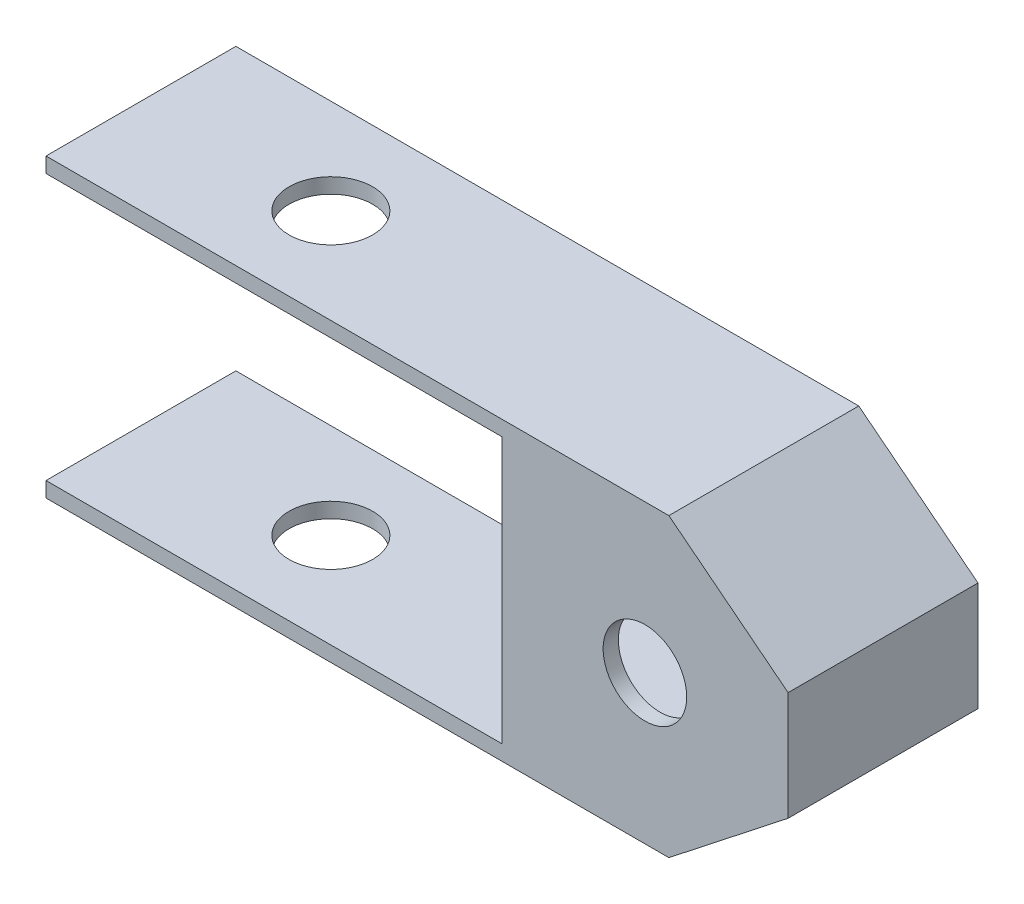
ISO-10303-21;
HEADER;
FILE_DESCRIPTION(('STEP AP214'),'2;1');
FILE_NAME('part.step','',(''),(''),'','','');
FILE_SCHEMA(('AUTOMOTIVE_DESIGN { 1 0 10303 214 1 1 1 1 }'));
ENDSEC;
DATA;
#1=APPLICATION_CONTEXT('core data for automotive mechanical design processes');
#2=APPLICATION_PROTOCOL_DEFINITION('international standard','automotive_design',2000,#1);
#3=PRODUCT_CONTEXT('',#1,'mechanical');
#4=PRODUCT('Part','Part','',(#3));
#5=PRODUCT_RELATED_PRODUCT_CATEGORY('part','',(#4));
#6=PRODUCT_DEFINITION_FORMATION('','',#4);
#7=PRODUCT_DEFINITION_CONTEXT('part definition',#1,'design');
#8=PRODUCT_DEFINITION('design','',#6,#7);
#9=PRODUCT_DEFINITION_SHAPE('','',#8);
#10=(LENGTH_UNIT() NAMED_UNIT(*) SI_UNIT(.MILLI.,.METRE.));
#11=(NAMED_UNIT(*) PLANE_ANGLE_UNIT() SI_UNIT($,.RADIAN.));
#12=(NAMED_UNIT(*) SI_UNIT($,.STERADIAN.) SOLID_ANGLE_UNIT());
#13=UNCERTAINTY_MEASURE_WITH_UNIT(LENGTH_MEASURE(1.E-05),#10,'distance_accuracy_value','');
#14=(GEOMETRIC_REPRESENTATION_CONTEXT(3) GLOBAL_UNCERTAINTY_ASSIGNED_CONTEXT((#13)) GLOBAL_UNIT_ASSIGNED_CONTEXT((#10,
#11,#12)) REPRESENTATION_CONTEXT('',''));
#15=CARTESIAN_POINT('',(0.,0.,0.));
#16=DIRECTION('',(0.,0.,1.));
#17=DIRECTION('',(1.,0.,0.));
#18=AXIS2_PLACEMENT_3D('',#15,#16,#17);
#19=CARTESIAN_POINT('',(0.,0.,0.));
#20=DIRECTION('',(-1.,0.,0.));
#21=DIRECTION('',(0.,0.,1.));
#22=AXIS2_PLACEMENT_3D('',#19,#20,#21);
#23=PLANE('',#22);
#24=DIRECTION('',(0.,0.,1.));
#25=VECTOR('',#24,1.);
#26=CARTESIAN_POINT('',(0.,0.,0.));
#27=LINE('',#26,#25);
#28=CARTESIAN_POINT('',(0.,0.,23.));
#29=VERTEX_POINT('',#28);
#30=CARTESIAN_POINT('',(0.,0.,25.));
#31=VERTEX_POINT('',#30);
#32=EDGE_CURVE('E269',#29,#31,#27,.T.);
#33=ORIENTED_EDGE('',*,*,#32,.F.);
#34=DIRECTION('',(0.,-1.,0.));
#35=VECTOR('',#34,1.);
#36=CARTESIAN_POINT('',(0.,0.,23.));
#37=LINE('',#36,#35);
#38=CARTESIAN_POINT('',(0.,-35.,23.));
#39=VERTEX_POINT('',#38);
#40=EDGE_CURVE('E218',#29,#39,#37,.T.);
#41=ORIENTED_EDGE('',*,*,#40,.T.);
#42=DIRECTION('',(0.,0.,1.));
#43=VECTOR('',#42,1.);
#44=CARTESIAN_POINT('',(0.,-35.,0.));
#45=LINE('',#44,#43);
#46=CARTESIAN_POINT('',(0.,-35.,25.));
#47=VERTEX_POINT('',#46);
#48=EDGE_CURVE('E248',#39,#47,#45,.T.);
#49=ORIENTED_EDGE('',*,*,#48,.T.);
#50=DIRECTION('',(0.,-1.,0.));
#51=VECTOR('',#50,1.);
#52=CARTESIAN_POINT('',(0.,0.,25.));
#53=LINE('',#52,#51);
#54=EDGE_CURVE('E252',#31,#47,#53,.T.);
#55=ORIENTED_EDGE('',*,*,#54,.F.);
#56=EDGE_LOOP('',(#33,#41,#49,#55));
#57=FACE_BOUND('',#56,.T.);
#58=ADVANCED_FACE('F41',(#57),#23,.T.);
#59=CARTESIAN_POINT('',(-60.,0.,25.));
#60=DIRECTION('',(1.,0.,0.));
#61=DIRECTION('',(0.,0.,-1.));
#62=AXIS2_PLACEMENT_3D('',#59,#60,#61);
#63=PLANE('',#62);
#64=DIRECTION('',(0.,0.,1.));
#65=VECTOR('',#64,1.);
#66=CARTESIAN_POINT('',(-60.,-35.,0.));
#67=LINE('',#66,#65);
#68=CARTESIAN_POINT('',(-60.,-35.,0.));
#69=VERTEX_POINT('',#68);
#70=CARTESIAN_POINT('',(-60.,-35.,25.));
#71=VERTEX_POINT('',#70);
#72=EDGE_CURVE('E259',#69,#71,#67,.T.);
#73=ORIENTED_EDGE('',*,*,#72,.F.);
#74=DIRECTION('',(0.,-1.,0.));
#75=VECTOR('',#74,1.);
#76=CARTESIAN_POINT('',(-60.,0.,0.));
#77=LINE('',#76,#75);
#78=CARTESIAN_POINT('',(-60.,-37.,0.));
#79=VERTEX_POINT('',#78);
#80=EDGE_CURVE('E262',#69,#79,#77,.T.);
#81=ORIENTED_EDGE('',*,*,#80,.T.);
#82=DIRECTION('',(0.,0.,-1.));
#83=VECTOR('',#82,1.);
#84=CARTESIAN_POINT('',(-60.,-37.,25.));
#85=LINE('',#84,#83);
#86=CARTESIAN_POINT('',(-60.,-37.,25.));
#87=VERTEX_POINT('',#86);
#88=EDGE_CURVE('E11',#87,#79,#85,.T.);
#89=ORIENTED_EDGE('',*,*,#88,.F.);
#90=DIRECTION('',(0.,-1.,0.));
#91=VECTOR('',#90,1.);
#92=CARTESIAN_POINT('',(-60.,0.,25.));
#93=LINE('',#92,#91);
#94=EDGE_CURVE('E279',#71,#87,#93,.T.);
#95=ORIENTED_EDGE('',*,*,#94,.F.);
#96=EDGE_LOOP('',(#73,#81,#89,#95));
#97=FACE_BOUND('',#96,.T.);
#98=ADVANCED_FACE('F43',(#97),#63,.F.);
#99=DIRECTION('',(0.,0.,1.));
#100=VECTOR('',#99,1.);
#101=CARTESIAN_POINT('',(-60.,0.,0.));
#102=LINE('',#101,#100);
#103=CARTESIAN_POINT('',(-60.,0.,0.));
#104=VERTEX_POINT('',#103);
#105=CARTESIAN_POINT('',(-60.,0.,25.));
#106=VERTEX_POINT('',#105);
#107=EDGE_CURVE('E263',#104,#106,#102,.T.);
#108=ORIENTED_EDGE('',*,*,#107,.T.);
#109=CARTESIAN_POINT('',(-60.,1.99999999999999,25.));
#110=VERTEX_POINT('',#109);
#111=EDGE_CURVE('E274',#110,#106,#93,.T.);
#112=ORIENTED_EDGE('',*,*,#111,.F.);
#113=DIRECTION('',(0.,0.,-1.));
#114=VECTOR('',#113,1.);
#115=CARTESIAN_POINT('',(-60.,1.99999999999999,25.));
#116=LINE('',#115,#114);
#117=CARTESIAN_POINT('',(-60.,1.99999999999999,0.));
#118=VERTEX_POINT('',#117);
#119=EDGE_CURVE('E297',#110,#118,#116,.T.);
#120=ORIENTED_EDGE('',*,*,#119,.T.);
#121=EDGE_CURVE('E298',#118,#104,#77,.T.);
#122=ORIENTED_EDGE('',*,*,#121,.T.);
#123=EDGE_LOOP('',(#108,#112,#120,#122));
#124=FACE_BOUND('',#123,.T.);
#125=ADVANCED_FACE('F352',(#124),#63,.F.);
#126=CARTESIAN_POINT('',(0.,0.,25.));
#127=DIRECTION('',(0.,0.,1.));
#128=DIRECTION('',(1.,0.,0.));
#129=AXIS2_PLACEMENT_3D('',#126,#127,#128);
#130=PLANE('',#129);
#131=CARTESIAN_POINT('',(18.8484526302729,-17.5,25.));
#132=DIRECTION('',(0.,0.,1.));
#133=DIRECTION('',(1.,0.,0.));
#134=AXIS2_PLACEMENT_3D('',#131,#132,#133);
#135=CIRCLE('',#134,5.5);
#136=CARTESIAN_POINT('',(24.3484526302729,-17.5,25.));
#137=VERTEX_POINT('',#136);
#138=EDGE_CURVE('E448',#137,#137,#135,.T.);
#139=ORIENTED_EDGE('',*,*,#138,.F.);
#140=EDGE_LOOP('',(#139));
#141=FACE_BOUND('',#140,.T.);
#142=ORIENTED_EDGE('',*,*,#54,.T.);
#143=DIRECTION('',(-1.,0.,0.));
#144=VECTOR('',#143,1.);
#145=CARTESIAN_POINT('',(0.,-35.,25.));
#146=LINE('',#145,#144);
#147=EDGE_CURVE('E237',#47,#71,#146,.T.);
#148=ORIENTED_EDGE('',*,*,#147,.T.);
#149=ORIENTED_EDGE('',*,*,#94,.T.);
#150=DIRECTION('',(-1.,0.,0.));
#151=VECTOR('',#150,1.);
#152=CARTESIAN_POINT('',(0.,-37.,25.));
#153=LINE('',#152,#151);
#154=CARTESIAN_POINT('',(22.,-37.,25.));
#155=VERTEX_POINT('',#154);
#156=EDGE_CURVE('E278',#155,#87,#153,.T.);
#157=ORIENTED_EDGE('',*,*,#156,.F.);
#158=DIRECTION('',(0.78628435317527,0.617864803943182,0.));
#159=VECTOR('',#158,1.);
#160=CARTESIAN_POINT('',(26.3738969765129,-33.5629775195864,25.));
#161=LINE('',#160,#159);
#162=CARTESIAN_POINT('',(37.6969052605458,-24.6653207555818,25.));
#163=VERTEX_POINT('',#162);
#164=EDGE_CURVE('E283',#155,#163,#161,.T.);
#165=ORIENTED_EDGE('',*,*,#164,.T.);
#166=DIRECTION('',(0.,1.,0.));
#167=VECTOR('',#166,1.);
#168=CARTESIAN_POINT('',(37.6969052605458,0.,25.));
#169=LINE('',#168,#167);
#170=CARTESIAN_POINT('',(37.6969052605458,-10.3346792444182,25.));
#171=VERTEX_POINT('',#170);
#172=EDGE_CURVE('E286',#163,#171,#169,.T.);
#173=ORIENTED_EDGE('',*,*,#172,.T.);
#174=DIRECTION('',(0.78628435317527,-0.617864803943182,0.));
#175=VECTOR('',#174,1.);
#176=CARTESIAN_POINT('',(9.37028700637488,11.9244695778976,25.));
#177=LINE('',#176,#175);
#178=CARTESIAN_POINT('',(22.,2.,25.));
#179=VERTEX_POINT('',#178);
#180=EDGE_CURVE('E289',#179,#171,#177,.T.);
#181=ORIENTED_EDGE('',*,*,#180,.F.);
#182=DIRECTION('',(1.,0.,0.));
#183=VECTOR('',#182,1.);
#184=CARTESIAN_POINT('',(0.,2.,25.));
#185=LINE('',#184,#183);
#186=EDGE_CURVE('E293',#110,#179,#185,.T.);
#187=ORIENTED_EDGE('',*,*,#186,.F.);
#188=ORIENTED_EDGE('',*,*,#111,.T.);
#189=DIRECTION('',(1.,0.,0.));
#190=VECTOR('',#189,1.);
#191=CARTESIAN_POINT('',(0.,0.,25.));
#192=LINE('',#191,#190);
#193=EDGE_CURVE('E242',#106,#31,#192,.T.);
#194=ORIENTED_EDGE('',*,*,#193,.T.);
#195=EDGE_LOOP('',(#142,#148,#149,#157,#165,#173,#181,#187,#188,#194));
#196=FACE_BOUND('',#195,.T.);
#197=ADVANCED_FACE('F355',(#141,#196),#130,.T.);
#198=CARTESIAN_POINT('',(0.,0.,0.));
#199=DIRECTION('',(0.,0.,1.));
#200=DIRECTION('',(1.,0.,0.));
#201=AXIS2_PLACEMENT_3D('',#198,#199,#200);
#202=PLANE('',#201);
#203=CARTESIAN_POINT('',(18.8484526302729,-17.5,0.));
#204=DIRECTION('',(0.,0.,1.));
#205=DIRECTION('',(1.,0.,0.));
#206=AXIS2_PLACEMENT_3D('',#203,#204,#205);
#207=CIRCLE('',#206,5.5);
#208=CARTESIAN_POINT('',(24.3484526302729,-17.5,0.));
#209=VERTEX_POINT('',#208);
#210=EDGE_CURVE('E222',#209,#209,#207,.T.);
#211=ORIENTED_EDGE('',*,*,#210,.T.);
#212=EDGE_LOOP('',(#211));
#213=FACE_BOUND('',#212,.T.);
#214=DIRECTION('',(-1.,0.,0.));
#215=VECTOR('',#214,1.);
#216=CARTESIAN_POINT('',(0.,-35.,0.));
#217=LINE('',#216,#215);
#218=CARTESIAN_POINT('',(0.,-35.,0.));
#219=VERTEX_POINT('',#218);
#220=EDGE_CURVE('E238',#219,#69,#217,.T.);
#221=ORIENTED_EDGE('',*,*,#220,.F.);
#222=DIRECTION('',(0.,-1.,0.));
#223=VECTOR('',#222,1.);
#224=CARTESIAN_POINT('',(0.,0.,0.));
#225=LINE('',#224,#223);
#226=CARTESIAN_POINT('',(0.,0.,0.));
#227=VERTEX_POINT('',#226);
#228=EDGE_CURVE('E241',#227,#219,#225,.T.);
#229=ORIENTED_EDGE('',*,*,#228,.F.);
#230=DIRECTION('',(1.,0.,0.));
#231=VECTOR('',#230,1.);
#232=CARTESIAN_POINT('',(0.,0.,0.));
#233=LINE('',#232,#231);
#234=EDGE_CURVE('E245',#104,#227,#233,.T.);
#235=ORIENTED_EDGE('',*,*,#234,.F.);
#236=ORIENTED_EDGE('',*,*,#121,.F.);
#237=DIRECTION('',(1.,0.,0.));
#238=VECTOR('',#237,1.);
#239=CARTESIAN_POINT('',(0.,2.,0.));
#240=LINE('',#239,#238);
#241=CARTESIAN_POINT('',(22.,2.,0.));
#242=VERTEX_POINT('',#241);
#243=EDGE_CURVE('E317',#118,#242,#240,.T.);
#244=ORIENTED_EDGE('',*,*,#243,.T.);
#245=DIRECTION('',(0.78628435317527,-0.617864803943182,0.));
#246=VECTOR('',#245,1.);
#247=CARTESIAN_POINT('',(9.37028700637488,11.9244695778976,0.));
#248=LINE('',#247,#246);
#249=CARTESIAN_POINT('',(37.6969052605458,-10.3346792444182,0.));
#250=VERTEX_POINT('',#249);
#251=EDGE_CURVE('E313',#242,#250,#248,.T.);
#252=ORIENTED_EDGE('',*,*,#251,.T.);
#253=DIRECTION('',(0.,1.,0.));
#254=VECTOR('',#253,1.);
#255=CARTESIAN_POINT('',(37.6969052605458,0.,0.));
#256=LINE('',#255,#254);
#257=CARTESIAN_POINT('',(37.6969052605458,-24.6653207555818,0.));
#258=VERTEX_POINT('',#257);
#259=EDGE_CURVE('E309',#258,#250,#256,.T.);
#260=ORIENTED_EDGE('',*,*,#259,.F.);
#261=DIRECTION('',(0.78628435317527,0.617864803943182,0.));
#262=VECTOR('',#261,1.);
#263=CARTESIAN_POINT('',(26.3738969765129,-33.5629775195864,0.));
#264=LINE('',#263,#262);
#265=CARTESIAN_POINT('',(22.,-37.,0.));
#266=VERTEX_POINT('',#265);
#267=EDGE_CURVE('E306',#266,#258,#264,.T.);
#268=ORIENTED_EDGE('',*,*,#267,.F.);
#269=DIRECTION('',(-1.,0.,0.));
#270=VECTOR('',#269,1.);
#271=CARTESIAN_POINT('',(0.,-37.,0.));
#272=LINE('',#271,#270);
#273=EDGE_CURVE('E302',#266,#79,#272,.T.);
#274=ORIENTED_EDGE('',*,*,#273,.T.);
#275=ORIENTED_EDGE('',*,*,#80,.F.);
#276=EDGE_LOOP('',(#221,#229,#235,#236,#244,#252,#260,#268,#274,#275));
#277=FACE_BOUND('',#276,.T.);
#278=ADVANCED_FACE('F363',(#213,#277),#202,.F.);
#279=CARTESIAN_POINT('',(0.,-37.,25.));
#280=DIRECTION('',(0.,-1.,0.));
#281=DIRECTION('',(1.,0.,0.));
#282=AXIS2_PLACEMENT_3D('',#279,#280,#281);
#283=PLANE('',#282);
#284=CARTESIAN_POINT('',(-35.,-37.,12.5));
#285=DIRECTION('',(0.,-1.,0.));
#286=DIRECTION('',(1.,0.,0.));
#287=AXIS2_PLACEMENT_3D('',#284,#285,#286);
#288=CIRCLE('',#287,5.5);
#289=CARTESIAN_POINT('',(-29.5,-37.,12.5));
#290=VERTEX_POINT('',#289);
#291=EDGE_CURVE('E233',#290,#290,#288,.T.);
#292=ORIENTED_EDGE('',*,*,#291,.F.);
#293=EDGE_LOOP('',(#292));
#294=FACE_BOUND('',#293,.T.);
#295=ORIENTED_EDGE('',*,*,#273,.F.);
#296=DIRECTION('',(0.,0.,-1.));
#297=VECTOR('',#296,1.);
#298=CARTESIAN_POINT('',(22.,-37.,25.));
#299=LINE('',#298,#297);
#300=EDGE_CURVE('E51',#155,#266,#299,.T.);
#301=ORIENTED_EDGE('',*,*,#300,.F.);
#302=ORIENTED_EDGE('',*,*,#156,.T.);
#303=ORIENTED_EDGE('',*,*,#88,.T.);
#304=EDGE_LOOP('',(#295,#301,#302,#303));
#305=FACE_BOUND('',#304,.T.);
#306=ADVANCED_FACE('F400',(#294,#305),#283,.T.);
#307=CARTESIAN_POINT('',(26.3738969765129,-33.5629775195864,25.));
#308=DIRECTION('',(-0.617864803943182,0.78628435317527,0.));
#309=DIRECTION('',(-0.78628435317527,-0.617864803943182,0.));
#310=AXIS2_PLACEMENT_3D('',#307,#308,#309);
#311=PLANE('',#310);
#312=ORIENTED_EDGE('',*,*,#267,.T.);
#313=DIRECTION('',(0.,0.,-1.));
#314=VECTOR('',#313,1.);
#315=CARTESIAN_POINT('',(37.6969052605458,-24.6653207555818,25.));
#316=LINE('',#315,#314);
#317=EDGE_CURVE('E329',#163,#258,#316,.T.);
#318=ORIENTED_EDGE('',*,*,#317,.F.);
#319=ORIENTED_EDGE('',*,*,#164,.F.);
#320=ORIENTED_EDGE('',*,*,#300,.T.);
#321=EDGE_LOOP('',(#312,#318,#319,#320));
#322=FACE_BOUND('',#321,.T.);
#323=ADVANCED_FACE('F405',(#322),#311,.F.);
#324=CARTESIAN_POINT('',(37.6969052605458,0.,25.));
#325=DIRECTION('',(-1.,0.,0.));
#326=DIRECTION('',(0.,0.,1.));
#327=AXIS2_PLACEMENT_3D('',#324,#325,#326);
#328=PLANE('',#327);
#329=ORIENTED_EDGE('',*,*,#259,.T.);
#330=DIRECTION('',(0.,0.,-1.));
#331=VECTOR('',#330,1.);
#332=CARTESIAN_POINT('',(37.6969052605458,-10.3346792444182,25.));
#333=LINE('',#332,#331);
#334=EDGE_CURVE('E326',#171,#250,#333,.T.);
#335=ORIENTED_EDGE('',*,*,#334,.F.);
#336=ORIENTED_EDGE('',*,*,#172,.F.);
#337=ORIENTED_EDGE('',*,*,#317,.T.);
#338=EDGE_LOOP('',(#329,#335,#336,#337));
#339=FACE_BOUND('',#338,.T.);
#340=ADVANCED_FACE('F409',(#339),#328,.F.);
#341=CARTESIAN_POINT('',(9.37028700637488,11.9244695778976,25.));
#342=DIRECTION('',(0.617864803943182,0.78628435317527,0.));
#343=DIRECTION('',(-0.78628435317527,0.617864803943182,0.));
#344=AXIS2_PLACEMENT_3D('',#341,#342,#343);
#345=PLANE('',#344);
#346=ORIENTED_EDGE('',*,*,#251,.F.);
#347=DIRECTION('',(0.,0.,-1.));
#348=VECTOR('',#347,1.);
#349=CARTESIAN_POINT('',(22.,2.,25.));
#350=LINE('',#349,#348);
#351=EDGE_CURVE('E323',#179,#242,#350,.T.);
#352=ORIENTED_EDGE('',*,*,#351,.F.);
#353=ORIENTED_EDGE('',*,*,#180,.T.);
#354=ORIENTED_EDGE('',*,*,#334,.T.);
#355=EDGE_LOOP('',(#346,#352,#353,#354));
#356=FACE_BOUND('',#355,.T.);
#357=ADVANCED_FACE('F412',(#356),#345,.T.);
#358=CARTESIAN_POINT('',(0.,2.,25.));
#359=DIRECTION('',(0.,1.,0.));
#360=DIRECTION('',(0.,0.,1.));
#361=AXIS2_PLACEMENT_3D('',#358,#359,#360);
#362=PLANE('',#361);
#363=CARTESIAN_POINT('',(-35.,2.,12.5));
#364=DIRECTION('',(0.,1.,0.));
#365=DIRECTION('',(0.,0.,1.));
#366=AXIS2_PLACEMENT_3D('',#363,#364,#365);
#367=CIRCLE('',#366,5.5);
#368=CARTESIAN_POINT('',(-35.,2.,18.));
#369=VERTEX_POINT('',#368);
#370=EDGE_CURVE('E211',#369,#369,#367,.T.);
#371=ORIENTED_EDGE('',*,*,#370,.F.);
#372=EDGE_LOOP('',(#371));
#373=FACE_BOUND('',#372,.T.);
#374=ORIENTED_EDGE('',*,*,#243,.F.);
#375=ORIENTED_EDGE('',*,*,#119,.F.);
#376=ORIENTED_EDGE('',*,*,#186,.T.);
#377=ORIENTED_EDGE('',*,*,#351,.T.);
#378=EDGE_LOOP('',(#374,#375,#376,#377));
#379=FACE_BOUND('',#378,.T.);
#380=ADVANCED_FACE('F359',(#373,#379),#362,.T.);
#381=CARTESIAN_POINT('',(0.,-35.,0.));
#382=DIRECTION('',(0.,1.,0.));
#383=DIRECTION('',(0.,0.,1.));
#384=AXIS2_PLACEMENT_3D('',#381,#382,#383);
#385=PLANE('',#384);
#386=CARTESIAN_POINT('',(-35.,-35.,12.5));
#387=DIRECTION('',(0.,1.,0.));
#388=DIRECTION('',(0.,0.,1.));
#389=AXIS2_PLACEMENT_3D('',#386,#387,#388);
#390=CIRCLE('',#389,5.5);
#391=CARTESIAN_POINT('',(-35.,-35.,18.));
#392=VERTEX_POINT('',#391);
#393=EDGE_CURVE('E229',#392,#392,#390,.T.);
#394=ORIENTED_EDGE('',*,*,#393,.F.);
#395=EDGE_LOOP('',(#394));
#396=FACE_BOUND('',#395,.T.);
#397=ORIENTED_EDGE('',*,*,#147,.F.);
#398=ORIENTED_EDGE('',*,*,#48,.F.);
#399=DIRECTION('',(-1.,0.,0.));
#400=VECTOR('',#399,1.);
#401=CARTESIAN_POINT('',(0.,-35.,23.));
#402=LINE('',#401,#400);
#403=CARTESIAN_POINT('',(21.3082122643633,-35.,23.));
#404=VERTEX_POINT('',#403);
#405=EDGE_CURVE('E170',#404,#39,#402,.T.);
#406=ORIENTED_EDGE('',*,*,#405,.F.);
#407=DIRECTION('',(0.,0.,-1.));
#408=VECTOR('',#407,1.);
#409=CARTESIAN_POINT('',(21.3082122643633,-35.,25.));
#410=LINE('',#409,#408);
#411=CARTESIAN_POINT('',(21.3082122643633,-35.,2.));
#412=VERTEX_POINT('',#411);
#413=EDGE_CURVE('E165',#404,#412,#410,.T.);
#414=ORIENTED_EDGE('',*,*,#413,.T.);
#415=DIRECTION('',(-1.,0.,0.));
#416=VECTOR('',#415,1.);
#417=CARTESIAN_POINT('',(0.,-35.,2.));
#418=LINE('',#417,#416);
#419=CARTESIAN_POINT('',(0.,-35.,2.));
#420=VERTEX_POINT('',#419);
#421=EDGE_CURVE('E205',#412,#420,#418,.T.);
#422=ORIENTED_EDGE('',*,*,#421,.T.);
#423=EDGE_CURVE('E270',#219,#420,#45,.T.);
#424=ORIENTED_EDGE('',*,*,#423,.F.);
#425=ORIENTED_EDGE('',*,*,#220,.T.);
#426=ORIENTED_EDGE('',*,*,#72,.T.);
#427=EDGE_LOOP('',(#397,#398,#406,#414,#422,#424,#425,#426));
#428=FACE_BOUND('',#427,.T.);
#429=ADVANCED_FACE('F344',(#396,#428),#385,.T.);
#430=CARTESIAN_POINT('',(0.,0.,0.));
#431=DIRECTION('',(0.,-1.,0.));
#432=DIRECTION('',(0.,0.,-1.));
#433=AXIS2_PLACEMENT_3D('',#430,#431,#432);
#434=PLANE('',#433);
#435=CARTESIAN_POINT('',(-35.,0.,12.5));
#436=DIRECTION('',(0.,-1.,0.));
#437=DIRECTION('',(0.,0.,-1.));
#438=AXIS2_PLACEMENT_3D('',#435,#436,#437);
#439=CIRCLE('',#438,5.5);
#440=CARTESIAN_POINT('',(-35.,0.,7.));
#441=VERTEX_POINT('',#440);
#442=EDGE_CURVE('E228',#441,#441,#439,.T.);
#443=ORIENTED_EDGE('',*,*,#442,.F.);
#444=EDGE_LOOP('',(#443));
#445=FACE_BOUND('',#444,.T.);
#446=ORIENTED_EDGE('',*,*,#193,.F.);
#447=ORIENTED_EDGE('',*,*,#107,.F.);
#448=ORIENTED_EDGE('',*,*,#234,.T.);
#449=CARTESIAN_POINT('',(0.,0.,2.));
#450=VERTEX_POINT('',#449);
#451=EDGE_CURVE('E67',#227,#450,#27,.T.);
#452=ORIENTED_EDGE('',*,*,#451,.T.);
#453=DIRECTION('',(1.,0.,0.));
#454=VECTOR('',#453,1.);
#455=CARTESIAN_POINT('',(0.,0.,2.));
#456=LINE('',#455,#454);
#457=CARTESIAN_POINT('',(21.3082122643633,0.,2.));
#458=VERTEX_POINT('',#457);
#459=EDGE_CURVE('E193',#450,#458,#456,.T.);
#460=ORIENTED_EDGE('',*,*,#459,.T.);
#461=DIRECTION('',(0.,0.,-1.));
#462=VECTOR('',#461,1.);
#463=CARTESIAN_POINT('',(21.3082122643633,0.,25.));
#464=LINE('',#463,#462);
#465=CARTESIAN_POINT('',(21.3082122643633,0.,23.));
#466=VERTEX_POINT('',#465);
#467=EDGE_CURVE('E192',#466,#458,#464,.T.);
#468=ORIENTED_EDGE('',*,*,#467,.F.);
#469=DIRECTION('',(1.,0.,0.));
#470=VECTOR('',#469,1.);
#471=CARTESIAN_POINT('',(0.,0.,23.));
#472=LINE('',#471,#470);
#473=EDGE_CURVE('E59',#29,#466,#472,.T.);
#474=ORIENTED_EDGE('',*,*,#473,.F.);
#475=ORIENTED_EDGE('',*,*,#32,.T.);
#476=EDGE_LOOP('',(#446,#447,#448,#452,#460,#468,#474,#475));
#477=FACE_BOUND('',#476,.T.);
#478=ADVANCED_FACE('F341',(#445,#477),#434,.T.);
#479=DIRECTION('',(0.,-1.,0.));
#480=VECTOR('',#479,1.);
#481=CARTESIAN_POINT('',(0.,0.,2.));
#482=LINE('',#481,#480);
#483=EDGE_CURVE('E209',#450,#420,#482,.T.);
#484=ORIENTED_EDGE('',*,*,#483,.F.);
#485=ORIENTED_EDGE('',*,*,#451,.F.);
#486=ORIENTED_EDGE('',*,*,#228,.T.);
#487=ORIENTED_EDGE('',*,*,#423,.T.);
#488=EDGE_LOOP('',(#484,#485,#486,#487));
#489=FACE_BOUND('',#488,.T.);
#490=ADVANCED_FACE('F343',(#489),#23,.T.);
#491=CARTESIAN_POINT('',(-35.,-65.,12.5));
#492=DIRECTION('',(0.,1.,0.));
#493=DIRECTION('',(0.,0.,1.));
#494=AXIS2_PLACEMENT_3D('',#491,#492,#493);
#495=CYLINDRICAL_SURFACE('',#494,5.5);
#496=ORIENTED_EDGE('',*,*,#442,.T.);
#497=EDGE_LOOP('',(#496));
#498=FACE_BOUND('',#497,.T.);
#499=ORIENTED_EDGE('',*,*,#370,.T.);
#500=EDGE_LOOP('',(#499));
#501=FACE_BOUND('',#500,.T.);
#502=ADVANCED_FACE('F338',(#498,#501),#495,.F.);
#503=ORIENTED_EDGE('',*,*,#291,.T.);
#504=EDGE_LOOP('',(#503));
#505=FACE_BOUND('',#504,.T.);
#506=ORIENTED_EDGE('',*,*,#393,.T.);
#507=EDGE_LOOP('',(#506));
#508=FACE_BOUND('',#507,.T.);
#509=ADVANCED_FACE('F379',(#505,#508),#495,.F.);
#510=CARTESIAN_POINT('',(0.,0.,23.));
#511=DIRECTION('',(0.,0.,1.));
#512=DIRECTION('',(1.,0.,0.));
#513=AXIS2_PLACEMENT_3D('',#510,#511,#512);
#514=PLANE('',#513);
#515=CARTESIAN_POINT('',(18.8484526302729,-17.5,23.));
#516=DIRECTION('',(0.,0.,1.));
#517=DIRECTION('',(1.,0.,0.));
#518=AXIS2_PLACEMENT_3D('',#515,#516,#517);
#519=CIRCLE('',#518,5.5);
#520=CARTESIAN_POINT('',(24.3484526302729,-17.5,23.));
#521=VERTEX_POINT('',#520);
#522=EDGE_CURVE('E454',#521,#521,#519,.T.);
#523=ORIENTED_EDGE('',*,*,#522,.T.);
#524=EDGE_LOOP('',(#523));
#525=FACE_BOUND('',#524,.T.);
#526=ORIENTED_EDGE('',*,*,#473,.T.);
#527=DIRECTION('',(0.78628435317527,-0.617864803943182,0.));
#528=VECTOR('',#527,1.);
#529=CARTESIAN_POINT('',(8.13455739848852,10.351900871547,23.));
#530=LINE('',#529,#528);
#531=CARTESIAN_POINT('',(35.6969052605458,-11.3066817890794,23.));
#532=VERTEX_POINT('',#531);
#533=EDGE_CURVE('E183',#466,#532,#530,.T.);
#534=ORIENTED_EDGE('',*,*,#533,.T.);
#535=DIRECTION('',(0.,1.,0.));
#536=VECTOR('',#535,1.);
#537=CARTESIAN_POINT('',(35.6969052605458,0.,23.));
#538=LINE('',#537,#536);
#539=CARTESIAN_POINT('',(35.6969052605458,-23.6933182109206,23.));
#540=VERTEX_POINT('',#539);
#541=EDGE_CURVE('E169',#540,#532,#538,.T.);
#542=ORIENTED_EDGE('',*,*,#541,.F.);
#543=DIRECTION('',(0.78628435317527,0.617864803943182,0.));
#544=VECTOR('',#543,1.);
#545=CARTESIAN_POINT('',(25.1381673686266,-31.9904088132359,23.));
#546=LINE('',#545,#544);
#547=EDGE_CURVE('E159',#404,#540,#546,.T.);
#548=ORIENTED_EDGE('',*,*,#547,.F.);
#549=ORIENTED_EDGE('',*,*,#405,.T.);
#550=ORIENTED_EDGE('',*,*,#40,.F.);
#551=EDGE_LOOP('',(#526,#534,#542,#548,#549,#550));
#552=FACE_BOUND('',#551,.T.);
#553=ADVANCED_FACE('F181',(#525,#552),#514,.F.);
#554=CARTESIAN_POINT('',(0.,0.,2.));
#555=DIRECTION('',(0.,0.,1.));
#556=DIRECTION('',(1.,0.,0.));
#557=AXIS2_PLACEMENT_3D('',#554,#555,#556);
#558=PLANE('',#557);
#559=CARTESIAN_POINT('',(18.8484526302729,-17.5,2.));
#560=DIRECTION('',(0.,0.,1.));
#561=DIRECTION('',(1.,0.,0.));
#562=AXIS2_PLACEMENT_3D('',#559,#560,#561);
#563=CIRCLE('',#562,5.5);
#564=CARTESIAN_POINT('',(24.3484526302729,-17.5,2.));
#565=VERTEX_POINT('',#564);
#566=EDGE_CURVE('E45',#565,#565,#563,.T.);
#567=ORIENTED_EDGE('',*,*,#566,.F.);
#568=EDGE_LOOP('',(#567));
#569=FACE_BOUND('',#568,.T.);
#570=ORIENTED_EDGE('',*,*,#421,.F.);
#571=DIRECTION('',(0.78628435317527,0.617864803943182,0.));
#572=VECTOR('',#571,1.);
#573=CARTESIAN_POINT('',(25.1381673686266,-31.9904088132359,2.));
#574=LINE('',#573,#572);
#575=CARTESIAN_POINT('',(35.6969052605458,-23.6933182109206,2.));
#576=VERTEX_POINT('',#575);
#577=EDGE_CURVE('E202',#412,#576,#574,.T.);
#578=ORIENTED_EDGE('',*,*,#577,.T.);
#579=DIRECTION('',(0.,1.,0.));
#580=VECTOR('',#579,1.);
#581=CARTESIAN_POINT('',(35.6969052605458,0.,2.));
#582=LINE('',#581,#580);
#583=CARTESIAN_POINT('',(35.6969052605458,-11.3066817890794,2.));
#584=VERTEX_POINT('',#583);
#585=EDGE_CURVE('E176',#576,#584,#582,.T.);
#586=ORIENTED_EDGE('',*,*,#585,.T.);
#587=DIRECTION('',(0.78628435317527,-0.617864803943182,0.));
#588=VECTOR('',#587,1.);
#589=CARTESIAN_POINT('',(8.13455739848852,10.351900871547,2.));
#590=LINE('',#589,#588);
#591=EDGE_CURVE('E196',#458,#584,#590,.T.);
#592=ORIENTED_EDGE('',*,*,#591,.F.);
#593=ORIENTED_EDGE('',*,*,#459,.F.);
#594=ORIENTED_EDGE('',*,*,#483,.T.);
#595=EDGE_LOOP('',(#570,#578,#586,#592,#593,#594));
#596=FACE_BOUND('',#595,.T.);
#597=ADVANCED_FACE('F370',(#569,#596),#558,.T.);
#598=CARTESIAN_POINT('',(25.1381673686266,-31.9904088132359,25.));
#599=DIRECTION('',(-0.617864803943182,0.78628435317527,0.));
#600=DIRECTION('',(-0.78628435317527,-0.617864803943182,0.));
#601=AXIS2_PLACEMENT_3D('',#598,#599,#600);
#602=PLANE('',#601);
#603=ORIENTED_EDGE('',*,*,#577,.F.);
#604=ORIENTED_EDGE('',*,*,#413,.F.);
#605=ORIENTED_EDGE('',*,*,#547,.T.);
#606=DIRECTION('',(0.,0.,-1.));
#607=VECTOR('',#606,1.);
#608=CARTESIAN_POINT('',(35.6969052605458,-23.6933182109206,25.));
#609=LINE('',#608,#607);
#610=EDGE_CURVE('E163',#540,#576,#609,.T.);
#611=ORIENTED_EDGE('',*,*,#610,.T.);
#612=EDGE_LOOP('',(#603,#604,#605,#611));
#613=FACE_BOUND('',#612,.T.);
#614=ADVANCED_FACE('F162',(#613),#602,.T.);
#615=CARTESIAN_POINT('',(35.6969052605458,0.,25.));
#616=DIRECTION('',(-1.,0.,0.));
#617=DIRECTION('',(0.,0.,1.));
#618=AXIS2_PLACEMENT_3D('',#615,#616,#617);
#619=PLANE('',#618);
#620=ORIENTED_EDGE('',*,*,#585,.F.);
#621=ORIENTED_EDGE('',*,*,#610,.F.);
#622=ORIENTED_EDGE('',*,*,#541,.T.);
#623=DIRECTION('',(0.,0.,-1.));
#624=VECTOR('',#623,1.);
#625=CARTESIAN_POINT('',(35.6969052605458,-11.3066817890794,25.));
#626=LINE('',#625,#624);
#627=EDGE_CURVE('E178',#532,#584,#626,.T.);
#628=ORIENTED_EDGE('',*,*,#627,.T.);
#629=EDGE_LOOP('',(#620,#621,#622,#628));
#630=FACE_BOUND('',#629,.T.);
#631=ADVANCED_FACE('F173',(#630),#619,.T.);
#632=CARTESIAN_POINT('',(8.13455739848852,10.351900871547,25.));
#633=DIRECTION('',(0.617864803943182,0.78628435317527,0.));
#634=DIRECTION('',(-0.78628435317527,0.617864803943182,0.));
#635=AXIS2_PLACEMENT_3D('',#632,#633,#634);
#636=PLANE('',#635);
#637=ORIENTED_EDGE('',*,*,#591,.T.);
#638=ORIENTED_EDGE('',*,*,#627,.F.);
#639=ORIENTED_EDGE('',*,*,#533,.F.);
#640=ORIENTED_EDGE('',*,*,#467,.T.);
#641=EDGE_LOOP('',(#637,#638,#639,#640));
#642=FACE_BOUND('',#641,.T.);
#643=ADVANCED_FACE('F368',(#642),#636,.F.);
#644=CARTESIAN_POINT('',(18.8484526302729,-17.5,-42.));
#645=DIRECTION('',(0.,0.,1.));
#646=DIRECTION('',(1.,0.,0.));
#647=AXIS2_PLACEMENT_3D('',#644,#645,#646);
#648=CYLINDRICAL_SURFACE('',#647,5.5);
#649=ORIENTED_EDGE('',*,*,#566,.T.);
#650=EDGE_LOOP('',(#649));
#651=FACE_BOUND('',#650,.T.);
#652=ORIENTED_EDGE('',*,*,#210,.F.);
#653=EDGE_LOOP('',(#652));
#654=FACE_BOUND('',#653,.T.);
#655=ADVANCED_FACE('F464',(#651,#654),#648,.F.);
#656=ORIENTED_EDGE('',*,*,#138,.T.);
#657=EDGE_LOOP('',(#656));
#658=FACE_BOUND('',#657,.T.);
#659=ORIENTED_EDGE('',*,*,#522,.F.);
#660=EDGE_LOOP('',(#659));
#661=FACE_BOUND('',#660,.T.);
#662=ADVANCED_FACE('F466',(#658,#661),#648,.F.);
#663=CLOSED_SHELL('',(#58,#98,#125,#197,#278,#306,#323,#340,#357,#380,#429,#478,#490,#502,#509,
#553,#597,#614,#631,#643,#655,#662));
#664=MANIFOLD_SOLID_BREP('B2',#663);
#665=ADVANCED_BREP_SHAPE_REPRESENTATION('',(#18,#664),#14);
#666=SHAPE_DEFINITION_REPRESENTATION(#9,#665);
ENDSEC;
END-ISO-10303-21;
